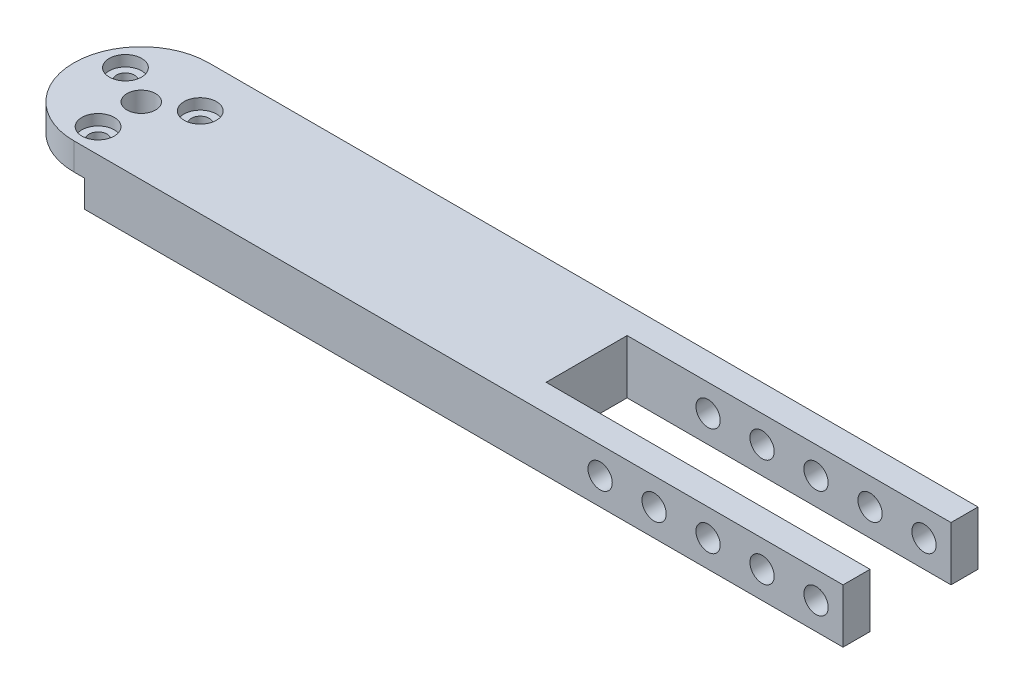
ISO-10303-21;
HEADER;
FILE_DESCRIPTION(('STEP AP214'),'2;1');
FILE_NAME('part.step','',(''),(''),'','','');
FILE_SCHEMA(('AUTOMOTIVE_DESIGN { 1 0 10303 214 1 1 1 1 }'));
ENDSEC;
DATA;
#1=APPLICATION_CONTEXT('core data for automotive mechanical design processes');
#2=APPLICATION_PROTOCOL_DEFINITION('international standard','automotive_design',2000,#1);
#3=PRODUCT_CONTEXT('',#1,'mechanical');
#4=PRODUCT('Part','Part','',(#3));
#5=PRODUCT_RELATED_PRODUCT_CATEGORY('part','',(#4));
#6=PRODUCT_DEFINITION_FORMATION('','',#4);
#7=PRODUCT_DEFINITION_CONTEXT('part definition',#1,'design');
#8=PRODUCT_DEFINITION('design','',#6,#7);
#9=PRODUCT_DEFINITION_SHAPE('','',#8);
#10=(LENGTH_UNIT() NAMED_UNIT(*) SI_UNIT(.MILLI.,.METRE.));
#11=(NAMED_UNIT(*) PLANE_ANGLE_UNIT() SI_UNIT($,.RADIAN.));
#12=(NAMED_UNIT(*) SI_UNIT($,.STERADIAN.) SOLID_ANGLE_UNIT());
#13=UNCERTAINTY_MEASURE_WITH_UNIT(LENGTH_MEASURE(1.E-05),#10,'distance_accuracy_value','');
#14=(GEOMETRIC_REPRESENTATION_CONTEXT(3) GLOBAL_UNCERTAINTY_ASSIGNED_CONTEXT((#13)) GLOBAL_UNIT_ASSIGNED_CONTEXT((#10,
#11,#12)) REPRESENTATION_CONTEXT('',''));
#15=CARTESIAN_POINT('',(0.,0.,0.));
#16=DIRECTION('',(0.,0.,1.));
#17=DIRECTION('',(1.,0.,0.));
#18=AXIS2_PLACEMENT_3D('',#15,#16,#17);
#19=CARTESIAN_POINT('',(5.57179676972482,10.001,-16.5000000000002));
#20=DIRECTION('',(0.,-1.,0.));
#21=DIRECTION('',(0.,0.,-1.));
#22=AXIS2_PLACEMENT_3D('',#19,#20,#21);
#23=CYLINDRICAL_SURFACE('',#22,1.65);
#24=CARTESIAN_POINT('',(5.57179676972482,5.,-16.5000000000002));
#25=DIRECTION('',(0.,-1.,0.));
#26=DIRECTION('',(0.,0.,-1.));
#27=AXIS2_PLACEMENT_3D('',#24,#25,#26);
#28=CIRCLE('',#27,1.65);
#29=CARTESIAN_POINT('',(5.57179676972482,5.,-18.1500000000002));
#30=VERTEX_POINT('',#29);
#31=EDGE_CURVE('E206',#30,#30,#28,.T.);
#32=ORIENTED_EDGE('',*,*,#31,.T.);
#33=EDGE_LOOP('',(#32));
#34=FACE_BOUND('',#33,.T.);
#35=CARTESIAN_POINT('',(5.57179676972482,8.,-16.5000000000002));
#36=DIRECTION('',(0.,1.,0.));
#37=DIRECTION('',(0.,0.,1.));
#38=AXIS2_PLACEMENT_3D('',#35,#36,#37);
#39=CIRCLE('',#38,1.65);
#40=CARTESIAN_POINT('',(5.57179676972482,8.,-14.8500000000002));
#41=VERTEX_POINT('',#40);
#42=EDGE_CURVE('E209',#41,#41,#39,.F.);
#43=ORIENTED_EDGE('',*,*,#42,.F.);
#44=EDGE_LOOP('',(#43));
#45=FACE_BOUND('',#44,.T.);
#46=ADVANCED_FACE('F41',(#34,#45),#23,.F.);
#47=CARTESIAN_POINT('',(19.4282032302758,10.001,-16.4999999999998));
#48=DIRECTION('',(0.,-1.,0.));
#49=DIRECTION('',(0.,0.,-1.));
#50=AXIS2_PLACEMENT_3D('',#47,#48,#49);
#51=CYLINDRICAL_SURFACE('',#50,1.65);
#52=CARTESIAN_POINT('',(19.4282032302758,5.,-16.4999999999998));
#53=DIRECTION('',(0.,-1.,0.));
#54=DIRECTION('',(0.,0.,-1.));
#55=AXIS2_PLACEMENT_3D('',#52,#53,#54);
#56=CIRCLE('',#55,1.65);
#57=CARTESIAN_POINT('',(19.4282032302758,5.,-18.1499999999998));
#58=VERTEX_POINT('',#57);
#59=EDGE_CURVE('E203',#58,#58,#56,.T.);
#60=ORIENTED_EDGE('',*,*,#59,.T.);
#61=EDGE_LOOP('',(#60));
#62=FACE_BOUND('',#61,.T.);
#63=CARTESIAN_POINT('',(19.4282032302758,8.,-16.4999999999998));
#64=DIRECTION('',(0.,1.,0.));
#65=DIRECTION('',(0.,0.,1.));
#66=AXIS2_PLACEMENT_3D('',#63,#64,#65);
#67=CIRCLE('',#66,1.65);
#68=CARTESIAN_POINT('',(19.4282032302758,8.,-14.8499999999998));
#69=VERTEX_POINT('',#68);
#70=EDGE_CURVE('E254',#69,#69,#67,.F.);
#71=ORIENTED_EDGE('',*,*,#70,.F.);
#72=EDGE_LOOP('',(#71));
#73=FACE_BOUND('',#72,.T.);
#74=ADVANCED_FACE('F345',(#62,#73),#51,.F.);
#75=CARTESIAN_POINT('',(12.5,10.001,-4.5));
#76=DIRECTION('',(0.,-1.,0.));
#77=DIRECTION('',(0.,0.,-1.));
#78=AXIS2_PLACEMENT_3D('',#75,#76,#77);
#79=CYLINDRICAL_SURFACE('',#78,1.65);
#80=CARTESIAN_POINT('',(12.5,5.,-4.5));
#81=DIRECTION('',(0.,-1.,0.));
#82=DIRECTION('',(0.,0.,-1.));
#83=AXIS2_PLACEMENT_3D('',#80,#81,#82);
#84=CIRCLE('',#83,1.65);
#85=CARTESIAN_POINT('',(12.5,5.,-6.15));
#86=VERTEX_POINT('',#85);
#87=EDGE_CURVE('E199',#86,#86,#84,.T.);
#88=ORIENTED_EDGE('',*,*,#87,.T.);
#89=EDGE_LOOP('',(#88));
#90=FACE_BOUND('',#89,.T.);
#91=CARTESIAN_POINT('',(12.5,8.,-4.5));
#92=DIRECTION('',(0.,1.,0.));
#93=DIRECTION('',(0.,0.,1.));
#94=AXIS2_PLACEMENT_3D('',#91,#92,#93);
#95=CIRCLE('',#94,1.65);
#96=CARTESIAN_POINT('',(12.5,8.,-2.85));
#97=VERTEX_POINT('',#96);
#98=EDGE_CURVE('E184',#97,#97,#95,.F.);
#99=ORIENTED_EDGE('',*,*,#98,.F.);
#100=EDGE_LOOP('',(#99));
#101=FACE_BOUND('',#100,.T.);
#102=ADVANCED_FACE('F351',(#90,#101),#79,.F.);
#103=CARTESIAN_POINT('',(12.5,-0.000999999999999265,-12.5));
#104=DIRECTION('',(0.,1.,0.));
#105=DIRECTION('',(0.,0.,1.));
#106=AXIS2_PLACEMENT_3D('',#103,#104,#105);
#107=CYLINDRICAL_SURFACE('',#106,2.65);
#108=CARTESIAN_POINT('',(12.5,10.,-12.5));
#109=DIRECTION('',(0.,1.,0.));
#110=DIRECTION('',(0.,0.,1.));
#111=AXIS2_PLACEMENT_3D('',#108,#109,#110);
#112=CIRCLE('',#111,2.65);
#113=CARTESIAN_POINT('',(12.5,10.,-9.85));
#114=VERTEX_POINT('',#113);
#115=EDGE_CURVE('E229',#114,#114,#112,.T.);
#116=ORIENTED_EDGE('',*,*,#115,.T.);
#117=EDGE_LOOP('',(#116));
#118=FACE_BOUND('',#117,.T.);
#119=CARTESIAN_POINT('',(12.5,5.,-12.5));
#120=DIRECTION('',(0.,-1.,0.));
#121=DIRECTION('',(0.,0.,-1.));
#122=AXIS2_PLACEMENT_3D('',#119,#120,#121);
#123=CIRCLE('',#122,2.65);
#124=CARTESIAN_POINT('',(12.5,5.,-15.15));
#125=VERTEX_POINT('',#124);
#126=EDGE_CURVE('E219',#125,#125,#123,.F.);
#127=ORIENTED_EDGE('',*,*,#126,.F.);
#128=EDGE_LOOP('',(#127));
#129=FACE_BOUND('',#128,.T.);
#130=ADVANCED_FACE('F366',(#118,#129),#107,.F.);
#131=CARTESIAN_POINT('',(12.5,10.,-12.5));
#132=DIRECTION('',(0.,-1.,0.));
#133=DIRECTION('',(0.,0.,-1.));
#134=AXIS2_PLACEMENT_3D('',#131,#132,#133);
#135=CYLINDRICAL_SURFACE('',#134,12.5);
#136=DIRECTION('',(0.,-1.,0.));
#137=VECTOR('',#136,1.);
#138=CARTESIAN_POINT('',(12.5,10.,-25.));
#139=LINE('',#138,#137);
#140=CARTESIAN_POINT('',(12.5,5.,-25.));
#141=VERTEX_POINT('',#140);
#142=CARTESIAN_POINT('',(12.5,10.,-25.));
#143=VERTEX_POINT('',#142);
#144=EDGE_CURVE('E50',#141,#143,#139,.F.);
#145=ORIENTED_EDGE('',*,*,#144,.F.);
#146=CARTESIAN_POINT('',(12.5,5.,-12.5));
#147=DIRECTION('',(0.,-1.,0.));
#148=DIRECTION('',(0.,0.,-1.));
#149=AXIS2_PLACEMENT_3D('',#146,#147,#148);
#150=CIRCLE('',#149,12.5);
#151=CARTESIAN_POINT('',(0.,5.,-12.5));
#152=VERTEX_POINT('',#151);
#153=EDGE_CURVE('E212',#141,#152,#150,.F.);
#154=ORIENTED_EDGE('',*,*,#153,.T.);
#155=DIRECTION('',(0.,-1.,0.));
#156=VECTOR('',#155,1.);
#157=CARTESIAN_POINT('',(0.,10.,-12.5));
#158=LINE('',#157,#156);
#159=CARTESIAN_POINT('',(0.,10.,-12.5));
#160=VERTEX_POINT('',#159);
#161=EDGE_CURVE('E228',#160,#152,#158,.T.);
#162=ORIENTED_EDGE('',*,*,#161,.F.);
#163=CARTESIAN_POINT('',(12.5,10.,-12.5));
#164=DIRECTION('',(0.,-1.,0.));
#165=DIRECTION('',(0.,0.,-1.));
#166=AXIS2_PLACEMENT_3D('',#163,#164,#165);
#167=CIRCLE('',#166,12.5);
#168=EDGE_CURVE('E244',#143,#160,#167,.F.);
#169=ORIENTED_EDGE('',*,*,#168,.F.);
#170=EDGE_LOOP('',(#145,#154,#162,#169));
#171=FACE_BOUND('',#170,.T.);
#172=ADVANCED_FACE('F43',(#171),#135,.T.);
#173=CARTESIAN_POINT('',(12.5,10.,-12.5));
#174=DIRECTION('',(0.,-1.,0.));
#175=DIRECTION('',(0.,0.,-1.));
#176=AXIS2_PLACEMENT_3D('',#173,#174,#175);
#177=CYLINDRICAL_SURFACE('',#176,12.5);
#178=ORIENTED_EDGE('',*,*,#161,.T.);
#179=CARTESIAN_POINT('',(12.5,5.,-12.5));
#180=DIRECTION('',(0.,-1.,0.));
#181=DIRECTION('',(0.,0.,-1.));
#182=AXIS2_PLACEMENT_3D('',#179,#180,#181);
#183=CIRCLE('',#182,12.5);
#184=CARTESIAN_POINT('',(12.5,5.,0.));
#185=VERTEX_POINT('',#184);
#186=EDGE_CURVE('E12',#152,#185,#183,.F.);
#187=ORIENTED_EDGE('',*,*,#186,.T.);
#188=DIRECTION('',(0.,-1.,0.));
#189=VECTOR('',#188,1.);
#190=CARTESIAN_POINT('',(12.5,10.,0.));
#191=LINE('',#190,#189);
#192=CARTESIAN_POINT('',(12.5,10.,0.));
#193=VERTEX_POINT('',#192);
#194=EDGE_CURVE('E238',#193,#185,#191,.T.);
#195=ORIENTED_EDGE('',*,*,#194,.F.);
#196=CARTESIAN_POINT('',(12.5,10.,-12.5));
#197=DIRECTION('',(0.,-1.,0.));
#198=DIRECTION('',(0.,0.,-1.));
#199=AXIS2_PLACEMENT_3D('',#196,#197,#198);
#200=CIRCLE('',#199,12.5);
#201=EDGE_CURVE('E246',#160,#193,#200,.F.);
#202=ORIENTED_EDGE('',*,*,#201,.F.);
#203=EDGE_LOOP('',(#178,#187,#195,#202));
#204=FACE_BOUND('',#203,.T.);
#205=ADVANCED_FACE('F380',(#204),#177,.T.);
#206=CARTESIAN_POINT('',(0.,10.,0.));
#207=DIRECTION('',(0.,0.,-1.));
#208=DIRECTION('',(-1.,0.,0.));
#209=AXIS2_PLACEMENT_3D('',#206,#207,#208);
#210=PLANE('',#209);
#211=CARTESIAN_POINT('',(150.,5.00000000000002,0.));
#212=DIRECTION('',(0.,0.,1.));
#213=DIRECTION('',(1.,0.,0.));
#214=AXIS2_PLACEMENT_3D('',#211,#212,#213);
#215=CIRCLE('',#214,2.25000000000003);
#216=CARTESIAN_POINT('',(152.25,5.00000000000002,0.));
#217=VERTEX_POINT('',#216);
#218=EDGE_CURVE('E310',#217,#217,#215,.T.);
#219=ORIENTED_EDGE('',*,*,#218,.F.);
#220=EDGE_LOOP('',(#219));
#221=FACE_BOUND('',#220,.T.);
#222=CARTESIAN_POINT('',(140.,4.99999999999993,0.));
#223=DIRECTION('',(0.,0.,1.));
#224=DIRECTION('',(1.,0.,0.));
#225=AXIS2_PLACEMENT_3D('',#222,#223,#224);
#226=CIRCLE('',#225,2.25000000000001);
#227=CARTESIAN_POINT('',(142.25,4.99999999999993,0.));
#228=VERTEX_POINT('',#227);
#229=EDGE_CURVE('E304',#228,#228,#226,.T.);
#230=ORIENTED_EDGE('',*,*,#229,.F.);
#231=EDGE_LOOP('',(#230));
#232=FACE_BOUND('',#231,.T.);
#233=CARTESIAN_POINT('',(130.,4.99999999999986,0.));
#234=DIRECTION('',(0.,0.,1.));
#235=DIRECTION('',(1.,0.,0.));
#236=AXIS2_PLACEMENT_3D('',#233,#234,#235);
#237=CIRCLE('',#236,2.25000000000001);
#238=CARTESIAN_POINT('',(132.25,4.99999999999986,0.));
#239=VERTEX_POINT('',#238);
#240=EDGE_CURVE('E298',#239,#239,#237,.T.);
#241=ORIENTED_EDGE('',*,*,#240,.F.);
#242=EDGE_LOOP('',(#241));
#243=FACE_BOUND('',#242,.T.);
#244=CARTESIAN_POINT('',(120.,4.99999999999979,0.));
#245=DIRECTION('',(0.,0.,1.));
#246=DIRECTION('',(1.,0.,0.));
#247=AXIS2_PLACEMENT_3D('',#244,#245,#246);
#248=CIRCLE('',#247,2.25000000000001);
#249=CARTESIAN_POINT('',(122.25,4.99999999999979,0.));
#250=VERTEX_POINT('',#249);
#251=EDGE_CURVE('E292',#250,#250,#248,.T.);
#252=ORIENTED_EDGE('',*,*,#251,.F.);
#253=EDGE_LOOP('',(#252));
#254=FACE_BOUND('',#253,.T.);
#255=CARTESIAN_POINT('',(110.,4.99999999999972,0.));
#256=DIRECTION('',(0.,0.,1.));
#257=DIRECTION('',(1.,0.,0.));
#258=AXIS2_PLACEMENT_3D('',#255,#256,#257);
#259=CIRCLE('',#258,2.25000000000001);
#260=CARTESIAN_POINT('',(112.25,4.99999999999972,0.));
#261=VERTEX_POINT('',#260);
#262=EDGE_CURVE('E286',#261,#261,#259,.T.);
#263=ORIENTED_EDGE('',*,*,#262,.F.);
#264=EDGE_LOOP('',(#263));
#265=FACE_BOUND('',#264,.T.);
#266=DIRECTION('',(1.,0.,0.));
#267=VECTOR('',#266,1.);
#268=CARTESIAN_POINT('',(0.,0.,0.));
#269=LINE('',#268,#267);
#270=CARTESIAN_POINT('',(14.4422924599555,0.,0.));
#271=VERTEX_POINT('',#270);
#272=CARTESIAN_POINT('',(155.,0.,0.));
#273=VERTEX_POINT('',#272);
#274=EDGE_CURVE('E232',#271,#273,#269,.T.);
#275=ORIENTED_EDGE('',*,*,#274,.T.);
#276=DIRECTION('',(0.,1.,0.));
#277=VECTOR('',#276,1.);
#278=CARTESIAN_POINT('',(155.,0.,0.));
#279=LINE('',#278,#277);
#280=CARTESIAN_POINT('',(155.,10.,0.));
#281=VERTEX_POINT('',#280);
#282=EDGE_CURVE('E173',#273,#281,#279,.T.);
#283=ORIENTED_EDGE('',*,*,#282,.T.);
#284=DIRECTION('',(1.,0.,0.));
#285=VECTOR('',#284,1.);
#286=CARTESIAN_POINT('',(0.,10.,0.));
#287=LINE('',#286,#285);
#288=EDGE_CURVE('E233',#193,#281,#287,.T.);
#289=ORIENTED_EDGE('',*,*,#288,.F.);
#290=ORIENTED_EDGE('',*,*,#194,.T.);
#291=DIRECTION('',(-1.,0.,0.));
#292=VECTOR('',#291,1.);
#293=CARTESIAN_POINT('',(0.,5.,0.));
#294=LINE('',#293,#292);
#295=CARTESIAN_POINT('',(14.4422924599555,5.,0.));
#296=VERTEX_POINT('',#295);
#297=EDGE_CURVE('E66',#296,#185,#294,.T.);
#298=ORIENTED_EDGE('',*,*,#297,.F.);
#299=DIRECTION('',(0.,-1.,0.));
#300=VECTOR('',#299,1.);
#301=CARTESIAN_POINT('',(14.4422924599555,5.,0.));
#302=LINE('',#301,#300);
#303=EDGE_CURVE('E225',#296,#271,#302,.T.);
#304=ORIENTED_EDGE('',*,*,#303,.T.);
#305=EDGE_LOOP('',(#275,#283,#289,#290,#298,#304));
#306=FACE_BOUND('',#305,.T.);
#307=ADVANCED_FACE('F378',(#221,#232,#243,#254,#265,#306),#210,.F.);
#308=CARTESIAN_POINT('',(0.,10.,-25.));
#309=DIRECTION('',(0.,0.,1.));
#310=DIRECTION('',(1.,0.,0.));
#311=AXIS2_PLACEMENT_3D('',#308,#309,#310);
#312=PLANE('',#311);
#313=CARTESIAN_POINT('',(150.,5.00000000000002,-25.));
#314=DIRECTION('',(0.,0.,1.));
#315=DIRECTION('',(1.,0.,0.));
#316=AXIS2_PLACEMENT_3D('',#313,#314,#315);
#317=CIRCLE('',#316,2.25000000000003);
#318=CARTESIAN_POINT('',(152.25,5.00000000000002,-25.));
#319=VERTEX_POINT('',#318);
#320=EDGE_CURVE('E263',#319,#319,#317,.T.);
#321=ORIENTED_EDGE('',*,*,#320,.T.);
#322=EDGE_LOOP('',(#321));
#323=FACE_BOUND('',#322,.T.);
#324=CARTESIAN_POINT('',(140.,4.99999999999993,-25.));
#325=DIRECTION('',(0.,0.,1.));
#326=DIRECTION('',(1.,0.,0.));
#327=AXIS2_PLACEMENT_3D('',#324,#325,#326);
#328=CIRCLE('',#327,2.25000000000001);
#329=CARTESIAN_POINT('',(142.25,4.99999999999993,-25.));
#330=VERTEX_POINT('',#329);
#331=EDGE_CURVE('E307',#330,#330,#328,.T.);
#332=ORIENTED_EDGE('',*,*,#331,.T.);
#333=EDGE_LOOP('',(#332));
#334=FACE_BOUND('',#333,.T.);
#335=CARTESIAN_POINT('',(130.,4.99999999999986,-25.));
#336=DIRECTION('',(0.,0.,1.));
#337=DIRECTION('',(1.,0.,0.));
#338=AXIS2_PLACEMENT_3D('',#335,#336,#337);
#339=CIRCLE('',#338,2.25000000000001);
#340=CARTESIAN_POINT('',(132.25,4.99999999999986,-25.));
#341=VERTEX_POINT('',#340);
#342=EDGE_CURVE('E301',#341,#341,#339,.T.);
#343=ORIENTED_EDGE('',*,*,#342,.T.);
#344=EDGE_LOOP('',(#343));
#345=FACE_BOUND('',#344,.T.);
#346=CARTESIAN_POINT('',(120.,4.99999999999979,-25.));
#347=DIRECTION('',(0.,0.,1.));
#348=DIRECTION('',(1.,0.,0.));
#349=AXIS2_PLACEMENT_3D('',#346,#347,#348);
#350=CIRCLE('',#349,2.25000000000001);
#351=CARTESIAN_POINT('',(122.25,4.99999999999979,-25.));
#352=VERTEX_POINT('',#351);
#353=EDGE_CURVE('E295',#352,#352,#350,.T.);
#354=ORIENTED_EDGE('',*,*,#353,.T.);
#355=EDGE_LOOP('',(#354));
#356=FACE_BOUND('',#355,.T.);
#357=CARTESIAN_POINT('',(110.,4.99999999999972,-25.));
#358=DIRECTION('',(0.,0.,1.));
#359=DIRECTION('',(1.,0.,0.));
#360=AXIS2_PLACEMENT_3D('',#357,#358,#359);
#361=CIRCLE('',#360,2.25000000000001);
#362=CARTESIAN_POINT('',(112.25,4.99999999999972,-25.));
#363=VERTEX_POINT('',#362);
#364=EDGE_CURVE('E289',#363,#363,#361,.T.);
#365=ORIENTED_EDGE('',*,*,#364,.T.);
#366=EDGE_LOOP('',(#365));
#367=FACE_BOUND('',#366,.T.);
#368=DIRECTION('',(-1.,0.,0.));
#369=VECTOR('',#368,1.);
#370=CARTESIAN_POINT('',(0.,10.,-25.));
#371=LINE('',#370,#369);
#372=CARTESIAN_POINT('',(155.,10.,-25.));
#373=VERTEX_POINT('',#372);
#374=EDGE_CURVE('E236',#373,#143,#371,.T.);
#375=ORIENTED_EDGE('',*,*,#374,.F.);
#376=DIRECTION('',(0.,1.,0.));
#377=VECTOR('',#376,1.);
#378=CARTESIAN_POINT('',(155.,0.,-25.));
#379=LINE('',#378,#377);
#380=CARTESIAN_POINT('',(155.,0.,-25.));
#381=VERTEX_POINT('',#380);
#382=EDGE_CURVE('E170',#381,#373,#379,.T.);
#383=ORIENTED_EDGE('',*,*,#382,.F.);
#384=DIRECTION('',(-1.,0.,0.));
#385=VECTOR('',#384,1.);
#386=CARTESIAN_POINT('',(0.,0.,-25.));
#387=LINE('',#386,#385);
#388=CARTESIAN_POINT('',(14.4422924599555,0.,-25.));
#389=VERTEX_POINT('',#388);
#390=EDGE_CURVE('E147',#381,#389,#387,.T.);
#391=ORIENTED_EDGE('',*,*,#390,.T.);
#392=DIRECTION('',(0.,-1.,0.));
#393=VECTOR('',#392,1.);
#394=CARTESIAN_POINT('',(14.4422924599555,5.,-25.));
#395=LINE('',#394,#393);
#396=CARTESIAN_POINT('',(14.4422924599555,5.,-25.));
#397=VERTEX_POINT('',#396);
#398=EDGE_CURVE('E222',#389,#397,#395,.F.);
#399=ORIENTED_EDGE('',*,*,#398,.T.);
#400=DIRECTION('',(1.,0.,0.));
#401=VECTOR('',#400,1.);
#402=CARTESIAN_POINT('',(0.,5.,-25.));
#403=LINE('',#402,#401);
#404=EDGE_CURVE('E216',#141,#397,#403,.T.);
#405=ORIENTED_EDGE('',*,*,#404,.F.);
#406=ORIENTED_EDGE('',*,*,#144,.T.);
#407=EDGE_LOOP('',(#375,#383,#391,#399,#405,#406));
#408=FACE_BOUND('',#407,.T.);
#409=ADVANCED_FACE('F316',(#323,#334,#345,#356,#367,#408),#312,.F.);
#410=CARTESIAN_POINT('',(0.,10.,0.));
#411=DIRECTION('',(0.,-1.,0.));
#412=DIRECTION('',(0.,0.,-1.));
#413=AXIS2_PLACEMENT_3D('',#410,#411,#412);
#414=PLANE('',#413);
#415=CARTESIAN_POINT('',(12.5,10.,-4.5));
#416=DIRECTION('',(0.,1.,0.));
#417=DIRECTION('',(0.,0.,1.));
#418=AXIS2_PLACEMENT_3D('',#415,#416,#417);
#419=CIRCLE('',#418,3.);
#420=CARTESIAN_POINT('',(12.5,10.,-1.5));
#421=VERTEX_POINT('',#420);
#422=EDGE_CURVE('E185',#421,#421,#419,.T.);
#423=ORIENTED_EDGE('',*,*,#422,.F.);
#424=EDGE_LOOP('',(#423));
#425=FACE_BOUND('',#424,.T.);
#426=CARTESIAN_POINT('',(5.57179676972451,10.,-16.5));
#427=DIRECTION('',(0.,1.,0.));
#428=DIRECTION('',(0.,0.,1.));
#429=AXIS2_PLACEMENT_3D('',#426,#427,#428);
#430=CIRCLE('',#429,3.);
#431=CARTESIAN_POINT('',(5.57179676972451,10.,-13.5));
#432=VERTEX_POINT('',#431);
#433=EDGE_CURVE('E191',#432,#432,#430,.T.);
#434=ORIENTED_EDGE('',*,*,#433,.F.);
#435=EDGE_LOOP('',(#434));
#436=FACE_BOUND('',#435,.T.);
#437=CARTESIAN_POINT('',(19.4282032302756,10.,-16.4999999999999));
#438=DIRECTION('',(0.,1.,0.));
#439=DIRECTION('',(0.,0.,1.));
#440=AXIS2_PLACEMENT_3D('',#437,#438,#439);
#441=CIRCLE('',#440,3.);
#442=CARTESIAN_POINT('',(19.4282032302756,10.,-13.4999999999999));
#443=VERTEX_POINT('',#442);
#444=EDGE_CURVE('E172',#443,#443,#441,.T.);
#445=ORIENTED_EDGE('',*,*,#444,.F.);
#446=EDGE_LOOP('',(#445));
#447=FACE_BOUND('',#446,.T.);
#448=ORIENTED_EDGE('',*,*,#115,.F.);
#449=EDGE_LOOP('',(#448));
#450=FACE_BOUND('',#449,.T.);
#451=DIRECTION('',(-1.,0.,0.));
#452=VECTOR('',#451,1.);
#453=CARTESIAN_POINT('',(95.,10.,-20.));
#454=LINE('',#453,#452);
#455=CARTESIAN_POINT('',(155.,10.,-20.));
#456=VERTEX_POINT('',#455);
#457=CARTESIAN_POINT('',(95.,10.,-20.));
#458=VERTEX_POINT('',#457);
#459=EDGE_CURVE('E163',#456,#458,#454,.T.);
#460=ORIENTED_EDGE('',*,*,#459,.F.);
#461=DIRECTION('',(0.,0.,1.));
#462=VECTOR('',#461,1.);
#463=CARTESIAN_POINT('',(155.,10.,-20.));
#464=LINE('',#463,#462);
#465=EDGE_CURVE('E132',#373,#456,#464,.T.);
#466=ORIENTED_EDGE('',*,*,#465,.F.);
#467=ORIENTED_EDGE('',*,*,#374,.T.);
#468=ORIENTED_EDGE('',*,*,#168,.T.);
#469=ORIENTED_EDGE('',*,*,#201,.T.);
#470=ORIENTED_EDGE('',*,*,#288,.T.);
#471=DIRECTION('',(0.,0.,1.));
#472=VECTOR('',#471,1.);
#473=CARTESIAN_POINT('',(155.,10.,0.));
#474=LINE('',#473,#472);
#475=CARTESIAN_POINT('',(155.,10.,-5.));
#476=VERTEX_POINT('',#475);
#477=EDGE_CURVE('E148',#476,#281,#474,.T.);
#478=ORIENTED_EDGE('',*,*,#477,.F.);
#479=DIRECTION('',(1.,0.,0.));
#480=VECTOR('',#479,1.);
#481=CARTESIAN_POINT('',(95.,10.,-5.));
#482=LINE('',#481,#480);
#483=CARTESIAN_POINT('',(95.,10.,-5.));
#484=VERTEX_POINT('',#483);
#485=EDGE_CURVE('E150',#484,#476,#482,.T.);
#486=ORIENTED_EDGE('',*,*,#485,.F.);
#487=DIRECTION('',(0.,0.,1.));
#488=VECTOR('',#487,1.);
#489=CARTESIAN_POINT('',(95.,10.,-5.));
#490=LINE('',#489,#488);
#491=EDGE_CURVE('E165',#458,#484,#490,.T.);
#492=ORIENTED_EDGE('',*,*,#491,.F.);
#493=EDGE_LOOP('',(#460,#466,#467,#468,#469,#470,#478,#486,#492));
#494=FACE_BOUND('',#493,.T.);
#495=ADVANCED_FACE('F370',(#425,#436,#447,#450,#494),#414,.F.);
#496=CARTESIAN_POINT('',(0.,0.,0.));
#497=DIRECTION('',(0.,-1.,0.));
#498=DIRECTION('',(0.,0.,-1.));
#499=AXIS2_PLACEMENT_3D('',#496,#497,#498);
#500=PLANE('',#499);
#501=DIRECTION('',(0.,0.,1.));
#502=VECTOR('',#501,1.);
#503=CARTESIAN_POINT('',(155.,0.,-20.));
#504=LINE('',#503,#502);
#505=CARTESIAN_POINT('',(155.,0.,-20.));
#506=VERTEX_POINT('',#505);
#507=EDGE_CURVE('E129',#381,#506,#504,.T.);
#508=ORIENTED_EDGE('',*,*,#507,.T.);
#509=DIRECTION('',(-1.,0.,0.));
#510=VECTOR('',#509,1.);
#511=CARTESIAN_POINT('',(95.,0.,-20.));
#512=LINE('',#511,#510);
#513=CARTESIAN_POINT('',(95.,0.,-20.));
#514=VERTEX_POINT('',#513);
#515=EDGE_CURVE('E140',#506,#514,#512,.T.);
#516=ORIENTED_EDGE('',*,*,#515,.T.);
#517=DIRECTION('',(0.,0.,1.));
#518=VECTOR('',#517,1.);
#519=CARTESIAN_POINT('',(95.,0.,-5.));
#520=LINE('',#519,#518);
#521=CARTESIAN_POINT('',(95.,0.,-5.));
#522=VERTEX_POINT('',#521);
#523=EDGE_CURVE('E58',#514,#522,#520,.T.);
#524=ORIENTED_EDGE('',*,*,#523,.T.);
#525=DIRECTION('',(1.,0.,0.));
#526=VECTOR('',#525,1.);
#527=CARTESIAN_POINT('',(95.,0.,-5.));
#528=LINE('',#527,#526);
#529=CARTESIAN_POINT('',(155.,0.,-5.));
#530=VERTEX_POINT('',#529);
#531=EDGE_CURVE('E157',#522,#530,#528,.T.);
#532=ORIENTED_EDGE('',*,*,#531,.T.);
#533=DIRECTION('',(0.,0.,1.));
#534=VECTOR('',#533,1.);
#535=CARTESIAN_POINT('',(155.,0.,0.));
#536=LINE('',#535,#534);
#537=EDGE_CURVE('E137',#530,#273,#536,.T.);
#538=ORIENTED_EDGE('',*,*,#537,.T.);
#539=ORIENTED_EDGE('',*,*,#274,.F.);
#540=CARTESIAN_POINT('',(12.5,0.,-12.5));
#541=DIRECTION('',(0.,-1.,0.));
#542=DIRECTION('',(0.,0.,-1.));
#543=AXIS2_PLACEMENT_3D('',#540,#541,#542);
#544=CIRCLE('',#543,12.65);
#545=EDGE_CURVE('E202',#389,#271,#544,.T.);
#546=ORIENTED_EDGE('',*,*,#545,.F.);
#547=ORIENTED_EDGE('',*,*,#390,.F.);
#548=EDGE_LOOP('',(#508,#516,#524,#532,#538,#539,#546,#547));
#549=FACE_BOUND('',#548,.T.);
#550=ADVANCED_FACE('F145',(#549),#500,.T.);
#551=CARTESIAN_POINT('',(12.5,5.,-12.5));
#552=DIRECTION('',(0.,-1.,0.));
#553=DIRECTION('',(0.,0.,-1.));
#554=AXIS2_PLACEMENT_3D('',#551,#552,#553);
#555=CYLINDRICAL_SURFACE('',#554,12.65);
#556=CARTESIAN_POINT('',(12.5,5.,-12.5));
#557=DIRECTION('',(0.,-1.,0.));
#558=DIRECTION('',(0.,0.,-1.));
#559=AXIS2_PLACEMENT_3D('',#556,#557,#558);
#560=CIRCLE('',#559,12.65);
#561=EDGE_CURVE('E210',#397,#296,#560,.T.);
#562=ORIENTED_EDGE('',*,*,#561,.F.);
#563=ORIENTED_EDGE('',*,*,#398,.F.);
#564=ORIENTED_EDGE('',*,*,#545,.T.);
#565=ORIENTED_EDGE('',*,*,#303,.F.);
#566=EDGE_LOOP('',(#562,#563,#564,#565));
#567=FACE_BOUND('',#566,.T.);
#568=ADVANCED_FACE('F361',(#567),#555,.F.);
#569=CARTESIAN_POINT('',(12.5,5.,-12.5));
#570=DIRECTION('',(0.,-1.,0.));
#571=DIRECTION('',(0.,0.,-1.));
#572=AXIS2_PLACEMENT_3D('',#569,#570,#571);
#573=PLANE('',#572);
#574=ORIENTED_EDGE('',*,*,#87,.F.);
#575=EDGE_LOOP('',(#574));
#576=FACE_BOUND('',#575,.T.);
#577=ORIENTED_EDGE('',*,*,#59,.F.);
#578=EDGE_LOOP('',(#577));
#579=FACE_BOUND('',#578,.T.);
#580=ORIENTED_EDGE('',*,*,#31,.F.);
#581=EDGE_LOOP('',(#580));
#582=FACE_BOUND('',#581,.T.);
#583=ORIENTED_EDGE('',*,*,#297,.T.);
#584=ORIENTED_EDGE('',*,*,#186,.F.);
#585=ORIENTED_EDGE('',*,*,#153,.F.);
#586=ORIENTED_EDGE('',*,*,#404,.T.);
#587=ORIENTED_EDGE('',*,*,#561,.T.);
#588=EDGE_LOOP('',(#583,#584,#585,#586,#587));
#589=FACE_BOUND('',#588,.T.);
#590=ORIENTED_EDGE('',*,*,#126,.T.);
#591=EDGE_LOOP('',(#590));
#592=FACE_BOUND('',#591,.T.);
#593=ADVANCED_FACE('F357',(#576,#579,#582,#589,#592),#573,.T.);
#594=CARTESIAN_POINT('',(12.5,8.,-4.5));
#595=DIRECTION('',(0.,1.,0.));
#596=DIRECTION('',(0.,0.,1.));
#597=AXIS2_PLACEMENT_3D('',#594,#595,#596);
#598=PLANE('',#597);
#599=CARTESIAN_POINT('',(12.5,8.,-4.5));
#600=DIRECTION('',(0.,1.,0.));
#601=DIRECTION('',(0.,0.,1.));
#602=AXIS2_PLACEMENT_3D('',#599,#600,#601);
#603=CIRCLE('',#602,3.);
#604=CARTESIAN_POINT('',(12.5,8.,-1.5));
#605=VERTEX_POINT('',#604);
#606=EDGE_CURVE('E181',#605,#605,#603,.T.);
#607=ORIENTED_EDGE('',*,*,#606,.T.);
#608=EDGE_LOOP('',(#607));
#609=FACE_BOUND('',#608,.T.);
#610=ORIENTED_EDGE('',*,*,#98,.T.);
#611=EDGE_LOOP('',(#610));
#612=FACE_BOUND('',#611,.T.);
#613=ADVANCED_FACE('F360',(#609,#612),#598,.T.);
#614=CARTESIAN_POINT('',(12.5,8.,-4.5));
#615=DIRECTION('',(0.,1.,0.));
#616=DIRECTION('',(0.,0.,1.));
#617=AXIS2_PLACEMENT_3D('',#614,#615,#616);
#618=CYLINDRICAL_SURFACE('',#617,3.);
#619=ORIENTED_EDGE('',*,*,#606,.F.);
#620=EDGE_LOOP('',(#619));
#621=FACE_BOUND('',#620,.T.);
#622=ORIENTED_EDGE('',*,*,#422,.T.);
#623=EDGE_LOOP('',(#622));
#624=FACE_BOUND('',#623,.T.);
#625=ADVANCED_FACE('F431',(#621,#624),#618,.F.);
#626=CARTESIAN_POINT('',(19.4282032302756,8.,-16.4999999999999));
#627=DIRECTION('',(0.,1.,0.));
#628=DIRECTION('',(0.,0.,1.));
#629=AXIS2_PLACEMENT_3D('',#626,#627,#628);
#630=PLANE('',#629);
#631=CARTESIAN_POINT('',(19.4282032302756,8.,-16.4999999999999));
#632=DIRECTION('',(0.,1.,0.));
#633=DIRECTION('',(0.,0.,1.));
#634=AXIS2_PLACEMENT_3D('',#631,#632,#633);
#635=CIRCLE('',#634,3.);
#636=CARTESIAN_POINT('',(19.4282032302756,8.,-13.4999999999999));
#637=VERTEX_POINT('',#636);
#638=EDGE_CURVE('E194',#637,#637,#635,.T.);
#639=ORIENTED_EDGE('',*,*,#638,.T.);
#640=EDGE_LOOP('',(#639));
#641=FACE_BOUND('',#640,.T.);
#642=ORIENTED_EDGE('',*,*,#70,.T.);
#643=EDGE_LOOP('',(#642));
#644=FACE_BOUND('',#643,.T.);
#645=ADVANCED_FACE('F435',(#641,#644),#630,.T.);
#646=CARTESIAN_POINT('',(19.4282032302756,8.,-16.4999999999999));
#647=DIRECTION('',(0.,1.,0.));
#648=DIRECTION('',(0.,0.,1.));
#649=AXIS2_PLACEMENT_3D('',#646,#647,#648);
#650=CYLINDRICAL_SURFACE('',#649,3.);
#651=ORIENTED_EDGE('',*,*,#638,.F.);
#652=EDGE_LOOP('',(#651));
#653=FACE_BOUND('',#652,.T.);
#654=ORIENTED_EDGE('',*,*,#444,.T.);
#655=EDGE_LOOP('',(#654));
#656=FACE_BOUND('',#655,.T.);
#657=ADVANCED_FACE('F440',(#653,#656),#650,.F.);
#658=CARTESIAN_POINT('',(5.57179676972451,8.,-16.5));
#659=DIRECTION('',(0.,1.,0.));
#660=DIRECTION('',(0.,0.,1.));
#661=AXIS2_PLACEMENT_3D('',#658,#659,#660);
#662=PLANE('',#661);
#663=CARTESIAN_POINT('',(5.57179676972451,8.,-16.5));
#664=DIRECTION('',(0.,1.,0.));
#665=DIRECTION('',(0.,0.,1.));
#666=AXIS2_PLACEMENT_3D('',#663,#664,#665);
#667=CIRCLE('',#666,3.);
#668=CARTESIAN_POINT('',(5.57179676972451,8.,-13.5));
#669=VERTEX_POINT('',#668);
#670=EDGE_CURVE('E188',#669,#669,#667,.T.);
#671=ORIENTED_EDGE('',*,*,#670,.T.);
#672=EDGE_LOOP('',(#671));
#673=FACE_BOUND('',#672,.T.);
#674=ORIENTED_EDGE('',*,*,#42,.T.);
#675=EDGE_LOOP('',(#674));
#676=FACE_BOUND('',#675,.T.);
#677=ADVANCED_FACE('F437',(#673,#676),#662,.T.);
#678=CARTESIAN_POINT('',(5.57179676972451,8.,-16.5));
#679=DIRECTION('',(0.,1.,0.));
#680=DIRECTION('',(0.,0.,1.));
#681=AXIS2_PLACEMENT_3D('',#678,#679,#680);
#682=CYLINDRICAL_SURFACE('',#681,3.);
#683=ORIENTED_EDGE('',*,*,#670,.F.);
#684=EDGE_LOOP('',(#683));
#685=FACE_BOUND('',#684,.T.);
#686=ORIENTED_EDGE('',*,*,#433,.T.);
#687=EDGE_LOOP('',(#686));
#688=FACE_BOUND('',#687,.T.);
#689=ADVANCED_FACE('F419',(#685,#688),#682,.F.);
#690=CARTESIAN_POINT('',(155.,0.,-20.));
#691=DIRECTION('',(-1.,0.,0.));
#692=DIRECTION('',(0.,0.,1.));
#693=AXIS2_PLACEMENT_3D('',#690,#691,#692);
#694=PLANE('',#693);
#695=ORIENTED_EDGE('',*,*,#465,.T.);
#696=DIRECTION('',(0.,1.,0.));
#697=VECTOR('',#696,1.);
#698=CARTESIAN_POINT('',(155.,0.,-20.));
#699=LINE('',#698,#697);
#700=EDGE_CURVE('E125',#506,#456,#699,.T.);
#701=ORIENTED_EDGE('',*,*,#700,.F.);
#702=ORIENTED_EDGE('',*,*,#507,.F.);
#703=ORIENTED_EDGE('',*,*,#382,.T.);
#704=EDGE_LOOP('',(#695,#701,#702,#703));
#705=FACE_BOUND('',#704,.T.);
#706=ADVANCED_FACE('F127',(#705),#694,.F.);
#707=CARTESIAN_POINT('',(155.,0.,0.));
#708=DIRECTION('',(-1.,0.,0.));
#709=DIRECTION('',(0.,0.,1.));
#710=AXIS2_PLACEMENT_3D('',#707,#708,#709);
#711=PLANE('',#710);
#712=ORIENTED_EDGE('',*,*,#477,.T.);
#713=ORIENTED_EDGE('',*,*,#282,.F.);
#714=ORIENTED_EDGE('',*,*,#537,.F.);
#715=DIRECTION('',(0.,1.,0.));
#716=VECTOR('',#715,1.);
#717=CARTESIAN_POINT('',(155.,0.,-5.));
#718=LINE('',#717,#716);
#719=EDGE_CURVE('E176',#530,#476,#718,.T.);
#720=ORIENTED_EDGE('',*,*,#719,.T.);
#721=EDGE_LOOP('',(#712,#713,#714,#720));
#722=FACE_BOUND('',#721,.T.);
#723=ADVANCED_FACE('F411',(#722),#711,.F.);
#724=CARTESIAN_POINT('',(95.,0.,-5.));
#725=DIRECTION('',(0.,0.,1.));
#726=DIRECTION('',(1.,0.,0.));
#727=AXIS2_PLACEMENT_3D('',#724,#725,#726);
#728=PLANE('',#727);
#729=CARTESIAN_POINT('',(150.,5.00000000000002,-5.));
#730=DIRECTION('',(0.,0.,1.));
#731=DIRECTION('',(1.,0.,0.));
#732=AXIS2_PLACEMENT_3D('',#729,#730,#731);
#733=CIRCLE('',#732,2.25000000000003);
#734=CARTESIAN_POINT('',(152.25,5.00000000000002,-5.));
#735=VERTEX_POINT('',#734);
#736=EDGE_CURVE('E153',#735,#735,#733,.T.);
#737=ORIENTED_EDGE('',*,*,#736,.T.);
#738=EDGE_LOOP('',(#737));
#739=FACE_BOUND('',#738,.T.);
#740=CARTESIAN_POINT('',(140.,4.99999999999993,-5.));
#741=DIRECTION('',(0.,0.,1.));
#742=DIRECTION('',(1.,0.,0.));
#743=AXIS2_PLACEMENT_3D('',#740,#741,#742);
#744=CIRCLE('',#743,2.25000000000001);
#745=CARTESIAN_POINT('',(142.25,4.99999999999993,-5.));
#746=VERTEX_POINT('',#745);
#747=EDGE_CURVE('E273',#746,#746,#744,.T.);
#748=ORIENTED_EDGE('',*,*,#747,.T.);
#749=EDGE_LOOP('',(#748));
#750=FACE_BOUND('',#749,.T.);
#751=CARTESIAN_POINT('',(130.,4.99999999999986,-5.));
#752=DIRECTION('',(0.,0.,1.));
#753=DIRECTION('',(1.,0.,0.));
#754=AXIS2_PLACEMENT_3D('',#751,#752,#753);
#755=CIRCLE('',#754,2.25000000000001);
#756=CARTESIAN_POINT('',(132.25,4.99999999999986,-5.));
#757=VERTEX_POINT('',#756);
#758=EDGE_CURVE('E270',#757,#757,#755,.T.);
#759=ORIENTED_EDGE('',*,*,#758,.T.);
#760=EDGE_LOOP('',(#759));
#761=FACE_BOUND('',#760,.T.);
#762=CARTESIAN_POINT('',(120.,4.99999999999979,-5.));
#763=DIRECTION('',(0.,0.,1.));
#764=DIRECTION('',(1.,0.,0.));
#765=AXIS2_PLACEMENT_3D('',#762,#763,#764);
#766=CIRCLE('',#765,2.25000000000001);
#767=CARTESIAN_POINT('',(122.25,4.99999999999979,-5.));
#768=VERTEX_POINT('',#767);
#769=EDGE_CURVE('E267',#768,#768,#766,.T.);
#770=ORIENTED_EDGE('',*,*,#769,.T.);
#771=EDGE_LOOP('',(#770));
#772=FACE_BOUND('',#771,.T.);
#773=CARTESIAN_POINT('',(110.,4.99999999999972,-5.));
#774=DIRECTION('',(0.,0.,1.));
#775=DIRECTION('',(1.,0.,0.));
#776=AXIS2_PLACEMENT_3D('',#773,#774,#775);
#777=CIRCLE('',#776,2.25000000000001);
#778=CARTESIAN_POINT('',(112.25,4.99999999999972,-5.));
#779=VERTEX_POINT('',#778);
#780=EDGE_CURVE('E262',#779,#779,#777,.T.);
#781=ORIENTED_EDGE('',*,*,#780,.T.);
#782=EDGE_LOOP('',(#781));
#783=FACE_BOUND('',#782,.T.);
#784=ORIENTED_EDGE('',*,*,#485,.T.);
#785=ORIENTED_EDGE('',*,*,#719,.F.);
#786=ORIENTED_EDGE('',*,*,#531,.F.);
#787=DIRECTION('',(0.,1.,0.));
#788=VECTOR('',#787,1.);
#789=CARTESIAN_POINT('',(95.,0.,-5.));
#790=LINE('',#789,#788);
#791=EDGE_CURVE('E178',#522,#484,#790,.T.);
#792=ORIENTED_EDGE('',*,*,#791,.T.);
#793=EDGE_LOOP('',(#784,#785,#786,#792));
#794=FACE_BOUND('',#793,.T.);
#795=ADVANCED_FACE('F332',(#739,#750,#761,#772,#783,#794),#728,.F.);
#796=CARTESIAN_POINT('',(95.,0.,-5.));
#797=DIRECTION('',(-1.,0.,0.));
#798=DIRECTION('',(0.,0.,1.));
#799=AXIS2_PLACEMENT_3D('',#796,#797,#798);
#800=PLANE('',#799);
#801=ORIENTED_EDGE('',*,*,#491,.T.);
#802=ORIENTED_EDGE('',*,*,#791,.F.);
#803=ORIENTED_EDGE('',*,*,#523,.F.);
#804=DIRECTION('',(0.,1.,0.));
#805=VECTOR('',#804,1.);
#806=CARTESIAN_POINT('',(95.,0.,-20.));
#807=LINE('',#806,#805);
#808=EDGE_CURVE('E136',#514,#458,#807,.T.);
#809=ORIENTED_EDGE('',*,*,#808,.T.);
#810=EDGE_LOOP('',(#801,#802,#803,#809));
#811=FACE_BOUND('',#810,.T.);
#812=ADVANCED_FACE('F407',(#811),#800,.F.);
#813=CARTESIAN_POINT('',(95.,0.,-20.));
#814=DIRECTION('',(0.,0.,-1.));
#815=DIRECTION('',(-1.,0.,0.));
#816=AXIS2_PLACEMENT_3D('',#813,#814,#815);
#817=PLANE('',#816);
#818=CARTESIAN_POINT('',(150.,5.00000000000002,-20.));
#819=DIRECTION('',(0.,0.,-1.));
#820=DIRECTION('',(-1.,0.,0.));
#821=AXIS2_PLACEMENT_3D('',#818,#819,#820);
#822=CIRCLE('',#821,2.25000000000003);
#823=CARTESIAN_POINT('',(147.75,5.00000000000002,-20.));
#824=VERTEX_POINT('',#823);
#825=EDGE_CURVE('E45',#824,#824,#822,.T.);
#826=ORIENTED_EDGE('',*,*,#825,.T.);
#827=EDGE_LOOP('',(#826));
#828=FACE_BOUND('',#827,.T.);
#829=CARTESIAN_POINT('',(140.,4.99999999999993,-20.));
#830=DIRECTION('',(0.,0.,-1.));
#831=DIRECTION('',(-1.,0.,0.));
#832=AXIS2_PLACEMENT_3D('',#829,#830,#831);
#833=CIRCLE('',#832,2.25000000000001);
#834=CARTESIAN_POINT('',(137.75,4.99999999999993,-20.));
#835=VERTEX_POINT('',#834);
#836=EDGE_CURVE('E271',#835,#835,#833,.T.);
#837=ORIENTED_EDGE('',*,*,#836,.T.);
#838=EDGE_LOOP('',(#837));
#839=FACE_BOUND('',#838,.T.);
#840=CARTESIAN_POINT('',(130.,4.99999999999986,-20.));
#841=DIRECTION('',(0.,0.,-1.));
#842=DIRECTION('',(-1.,0.,0.));
#843=AXIS2_PLACEMENT_3D('',#840,#841,#842);
#844=CIRCLE('',#843,2.25000000000001);
#845=CARTESIAN_POINT('',(127.75,4.99999999999986,-20.));
#846=VERTEX_POINT('',#845);
#847=EDGE_CURVE('E268',#846,#846,#844,.T.);
#848=ORIENTED_EDGE('',*,*,#847,.T.);
#849=EDGE_LOOP('',(#848));
#850=FACE_BOUND('',#849,.T.);
#851=CARTESIAN_POINT('',(120.,4.99999999999979,-20.));
#852=DIRECTION('',(0.,0.,-1.));
#853=DIRECTION('',(-1.,0.,0.));
#854=AXIS2_PLACEMENT_3D('',#851,#852,#853);
#855=CIRCLE('',#854,2.25000000000001);
#856=CARTESIAN_POINT('',(117.75,4.99999999999979,-20.));
#857=VERTEX_POINT('',#856);
#858=EDGE_CURVE('E264',#857,#857,#855,.T.);
#859=ORIENTED_EDGE('',*,*,#858,.T.);
#860=EDGE_LOOP('',(#859));
#861=FACE_BOUND('',#860,.T.);
#862=CARTESIAN_POINT('',(110.,4.99999999999972,-20.));
#863=DIRECTION('',(0.,0.,-1.));
#864=DIRECTION('',(-1.,0.,0.));
#865=AXIS2_PLACEMENT_3D('',#862,#863,#864);
#866=CIRCLE('',#865,2.25000000000001);
#867=CARTESIAN_POINT('',(107.75,4.99999999999972,-20.));
#868=VERTEX_POINT('',#867);
#869=EDGE_CURVE('E259',#868,#868,#866,.T.);
#870=ORIENTED_EDGE('',*,*,#869,.T.);
#871=EDGE_LOOP('',(#870));
#872=FACE_BOUND('',#871,.T.);
#873=ORIENTED_EDGE('',*,*,#459,.T.);
#874=ORIENTED_EDGE('',*,*,#808,.F.);
#875=ORIENTED_EDGE('',*,*,#515,.F.);
#876=ORIENTED_EDGE('',*,*,#700,.T.);
#877=EDGE_LOOP('',(#873,#874,#875,#876));
#878=FACE_BOUND('',#877,.T.);
#879=ADVANCED_FACE('F141',(#828,#839,#850,#861,#872,#878),#817,.F.);
#880=CARTESIAN_POINT('',(110.,4.99999999999972,-25.));
#881=DIRECTION('',(0.,0.,1.));
#882=DIRECTION('',(1.,0.,0.));
#883=AXIS2_PLACEMENT_3D('',#880,#881,#882);
#884=CYLINDRICAL_SURFACE('',#883,2.25000000000001);
#885=ORIENTED_EDGE('',*,*,#364,.F.);
#886=EDGE_LOOP('',(#885));
#887=FACE_BOUND('',#886,.T.);
#888=ORIENTED_EDGE('',*,*,#869,.F.);
#889=EDGE_LOOP('',(#888));
#890=FACE_BOUND('',#889,.T.);
#891=ADVANCED_FACE('F427',(#887,#890),#884,.F.);
#892=CARTESIAN_POINT('',(120.,4.99999999999979,-25.));
#893=DIRECTION('',(0.,0.,1.));
#894=DIRECTION('',(1.,0.,0.));
#895=AXIS2_PLACEMENT_3D('',#892,#893,#894);
#896=CYLINDRICAL_SURFACE('',#895,2.25000000000001);
#897=ORIENTED_EDGE('',*,*,#353,.F.);
#898=EDGE_LOOP('',(#897));
#899=FACE_BOUND('',#898,.T.);
#900=ORIENTED_EDGE('',*,*,#858,.F.);
#901=EDGE_LOOP('',(#900));
#902=FACE_BOUND('',#901,.T.);
#903=ADVANCED_FACE('F571',(#899,#902),#896,.F.);
#904=CARTESIAN_POINT('',(130.,4.99999999999986,-25.));
#905=DIRECTION('',(0.,0.,1.));
#906=DIRECTION('',(1.,0.,0.));
#907=AXIS2_PLACEMENT_3D('',#904,#905,#906);
#908=CYLINDRICAL_SURFACE('',#907,2.25000000000001);
#909=ORIENTED_EDGE('',*,*,#342,.F.);
#910=EDGE_LOOP('',(#909));
#911=FACE_BOUND('',#910,.T.);
#912=ORIENTED_EDGE('',*,*,#847,.F.);
#913=EDGE_LOOP('',(#912));
#914=FACE_BOUND('',#913,.T.);
#915=ADVANCED_FACE('F579',(#911,#914),#908,.F.);
#916=CARTESIAN_POINT('',(140.,4.99999999999993,-25.));
#917=DIRECTION('',(0.,0.,1.));
#918=DIRECTION('',(1.,0.,0.));
#919=AXIS2_PLACEMENT_3D('',#916,#917,#918);
#920=CYLINDRICAL_SURFACE('',#919,2.25000000000001);
#921=ORIENTED_EDGE('',*,*,#331,.F.);
#922=EDGE_LOOP('',(#921));
#923=FACE_BOUND('',#922,.T.);
#924=ORIENTED_EDGE('',*,*,#836,.F.);
#925=EDGE_LOOP('',(#924));
#926=FACE_BOUND('',#925,.T.);
#927=ADVANCED_FACE('F323',(#923,#926),#920,.F.);
#928=CARTESIAN_POINT('',(150.,5.00000000000002,-25.));
#929=DIRECTION('',(0.,0.,1.));
#930=DIRECTION('',(1.,0.,0.));
#931=AXIS2_PLACEMENT_3D('',#928,#929,#930);
#932=CYLINDRICAL_SURFACE('',#931,2.25000000000003);
#933=ORIENTED_EDGE('',*,*,#320,.F.);
#934=EDGE_LOOP('',(#933));
#935=FACE_BOUND('',#934,.T.);
#936=ORIENTED_EDGE('',*,*,#825,.F.);
#937=EDGE_LOOP('',(#936));
#938=FACE_BOUND('',#937,.T.);
#939=ADVANCED_FACE('F319',(#935,#938),#932,.F.);
#940=ORIENTED_EDGE('',*,*,#262,.T.);
#941=EDGE_LOOP('',(#940));
#942=FACE_BOUND('',#941,.T.);
#943=ORIENTED_EDGE('',*,*,#780,.F.);
#944=EDGE_LOOP('',(#943));
#945=FACE_BOUND('',#944,.T.);
#946=ADVANCED_FACE('F322',(#942,#945),#884,.F.);
#947=ORIENTED_EDGE('',*,*,#251,.T.);
#948=EDGE_LOOP('',(#947));
#949=FACE_BOUND('',#948,.T.);
#950=ORIENTED_EDGE('',*,*,#769,.F.);
#951=EDGE_LOOP('',(#950));
#952=FACE_BOUND('',#951,.T.);
#953=ADVANCED_FACE('F581',(#949,#952),#896,.F.);
#954=ORIENTED_EDGE('',*,*,#240,.T.);
#955=EDGE_LOOP('',(#954));
#956=FACE_BOUND('',#955,.T.);
#957=ORIENTED_EDGE('',*,*,#758,.F.);
#958=EDGE_LOOP('',(#957));
#959=FACE_BOUND('',#958,.T.);
#960=ADVANCED_FACE('F341',(#956,#959),#908,.F.);
#961=ORIENTED_EDGE('',*,*,#229,.T.);
#962=EDGE_LOOP('',(#961));
#963=FACE_BOUND('',#962,.T.);
#964=ORIENTED_EDGE('',*,*,#747,.F.);
#965=EDGE_LOOP('',(#964));
#966=FACE_BOUND('',#965,.T.);
#967=ADVANCED_FACE('F336',(#963,#966),#920,.F.);
#968=ORIENTED_EDGE('',*,*,#218,.T.);
#969=EDGE_LOOP('',(#968));
#970=FACE_BOUND('',#969,.T.);
#971=ORIENTED_EDGE('',*,*,#736,.F.);
#972=EDGE_LOOP('',(#971));
#973=FACE_BOUND('',#972,.T.);
#974=ADVANCED_FACE('F325',(#970,#973),#932,.F.);
#975=CLOSED_SHELL('',(#46,#74,#102,#130,#172,#205,#307,#409,#495,#550,#568,#593,#613,#625,#645,
#657,#677,#689,#706,#723,#795,#812,#879,#891,#903,#915,#927,#939,#946,#953,#960,#967,#974));
#976=MANIFOLD_SOLID_BREP('B2',#975);
#977=ADVANCED_BREP_SHAPE_REPRESENTATION('',(#18,#976),#14);
#978=SHAPE_DEFINITION_REPRESENTATION(#9,#977);
ENDSEC;
END-ISO-10303-21;
